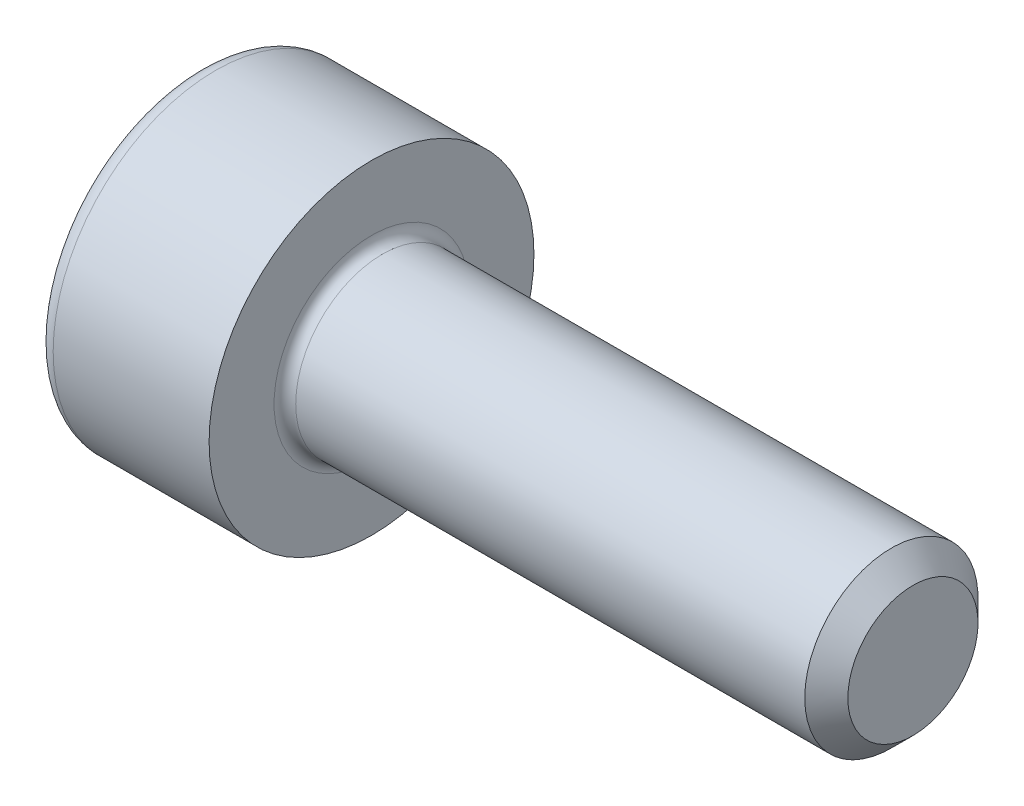
ISO-10303-21;
HEADER;
FILE_DESCRIPTION(('STEP AP214'),'2;1');
FILE_NAME('part.step','',(''),(''),'','','');
FILE_SCHEMA(('AUTOMOTIVE_DESIGN { 1 0 10303 214 1 1 1 1 }'));
ENDSEC;
DATA;
#1=APPLICATION_CONTEXT('core data for automotive mechanical design processes');
#2=APPLICATION_PROTOCOL_DEFINITION('international standard','automotive_design',2000,#1);
#3=PRODUCT_CONTEXT('',#1,'mechanical');
#4=PRODUCT('Part','Part','',(#3));
#5=PRODUCT_RELATED_PRODUCT_CATEGORY('part','',(#4));
#6=PRODUCT_DEFINITION_FORMATION('','',#4);
#7=PRODUCT_DEFINITION_CONTEXT('part definition',#1,'design');
#8=PRODUCT_DEFINITION('design','',#6,#7);
#9=PRODUCT_DEFINITION_SHAPE('','',#8);
#10=(LENGTH_UNIT() NAMED_UNIT(*) SI_UNIT(.MILLI.,.METRE.));
#11=(NAMED_UNIT(*) PLANE_ANGLE_UNIT() SI_UNIT($,.RADIAN.));
#12=(NAMED_UNIT(*) SI_UNIT($,.STERADIAN.) SOLID_ANGLE_UNIT());
#13=UNCERTAINTY_MEASURE_WITH_UNIT(LENGTH_MEASURE(1.E-05),#10,'distance_accuracy_value','');
#14=(GEOMETRIC_REPRESENTATION_CONTEXT(3) GLOBAL_UNCERTAINTY_ASSIGNED_CONTEXT((#13)) GLOBAL_UNIT_ASSIGNED_CONTEXT((#10,
#11,#12)) REPRESENTATION_CONTEXT('',''));
#15=CARTESIAN_POINT('',(0.,0.,0.));
#16=DIRECTION('',(0.,0.,1.));
#17=DIRECTION('',(1.,0.,0.));
#18=AXIS2_PLACEMENT_3D('',#15,#16,#17);
#19=CARTESIAN_POINT('',(0.,0.,0.));
#20=DIRECTION('',(-1.,0.,0.));
#21=DIRECTION('',(0.,0.,1.));
#22=AXIS2_PLACEMENT_3D('',#19,#20,#21);
#23=PLANE('',#22);
#24=DIRECTION('',(0.,-0.499999999999998,0.866025403784439));
#25=VECTOR('',#24,1.);
#26=CARTESIAN_POINT('',(0.,0.877572409168226,0.));
#27=LINE('',#26,#25);
#28=CARTESIAN_POINT('',(0.,0.877572409168226,0.));
#29=VERTEX_POINT('',#28);
#30=CARTESIAN_POINT('',(0.,0.438786204584111,0.759999999999998));
#31=VERTEX_POINT('',#30);
#32=EDGE_CURVE('E260',#29,#31,#27,.T.);
#33=ORIENTED_EDGE('',*,*,#32,.T.);
#34=DIRECTION('',(0.,1.,0.));
#35=VECTOR('',#34,1.);
#36=CARTESIAN_POINT('',(0.,-0.43878620458412,0.759999999999999));
#37=LINE('',#36,#35);
#38=CARTESIAN_POINT('',(0.,-0.43878620458412,0.759999999999999));
#39=VERTEX_POINT('',#38);
#40=EDGE_CURVE('E132',#39,#31,#37,.T.);
#41=ORIENTED_EDGE('',*,*,#40,.F.);
#42=DIRECTION('',(0.,-0.500000000000001,-0.866025403784438));
#43=VECTOR('',#42,1.);
#44=CARTESIAN_POINT('',(0.,-0.43878620458412,0.759999999999999));
#45=LINE('',#44,#43);
#46=CARTESIAN_POINT('',(0.,-0.877572409168236,0.));
#47=VERTEX_POINT('',#46);
#48=EDGE_CURVE('E263',#39,#47,#45,.T.);
#49=ORIENTED_EDGE('',*,*,#48,.T.);
#50=DIRECTION('',(0.,0.499999999999998,-0.86602540378444));
#51=VECTOR('',#50,1.);
#52=CARTESIAN_POINT('',(0.,-0.877572409168236,0.));
#53=LINE('',#52,#51);
#54=CARTESIAN_POINT('',(0.,-0.438786204584122,-0.760000000000001));
#55=VERTEX_POINT('',#54);
#56=EDGE_CURVE('E266',#47,#55,#53,.T.);
#57=ORIENTED_EDGE('',*,*,#56,.T.);
#58=DIRECTION('',(0.,-1.,0.));
#59=VECTOR('',#58,1.);
#60=CARTESIAN_POINT('',(0.,0.438786204584109,-0.760000000000002));
#61=LINE('',#60,#59);
#62=CARTESIAN_POINT('',(0.,0.438786204584109,-0.760000000000002));
#63=VERTEX_POINT('',#62);
#64=EDGE_CURVE('E269',#63,#55,#61,.T.);
#65=ORIENTED_EDGE('',*,*,#64,.F.);
#66=DIRECTION('',(0.,-0.500000000000001,-0.866025403784438));
#67=VECTOR('',#66,1.);
#68=CARTESIAN_POINT('',(0.,0.877572409168226,0.));
#69=LINE('',#68,#67);
#70=EDGE_CURVE('E127',#29,#63,#69,.T.);
#71=ORIENTED_EDGE('',*,*,#70,.F.);
#72=EDGE_LOOP('',(#33,#41,#49,#57,#65,#71));
#73=FACE_BOUND('',#72,.T.);
#74=CARTESIAN_POINT('',(0.,0.,0.));
#75=DIRECTION('',(-1.,0.,0.));
#76=DIRECTION('',(0.,0.,1.));
#77=AXIS2_PLACEMENT_3D('',#74,#75,#76);
#78=CIRCLE('',#77,1.34);
#79=CARTESIAN_POINT('',(0.,0.,1.34));
#80=VERTEX_POINT('',#79);
#81=EDGE_CURVE('E44',#80,#80,#78,.T.);
#82=ORIENTED_EDGE('',*,*,#81,.T.);
#83=EDGE_LOOP('',(#82));
#84=FACE_BOUND('',#83,.T.);
#85=ADVANCED_FACE('F36',(#73,#84),#23,.T.);
#86=CARTESIAN_POINT('',(-31.75,0.,0.));
#87=DIRECTION('',(-1.,0.,0.));
#88=DIRECTION('',(0.,0.,1.));
#89=AXIS2_PLACEMENT_3D('',#86,#87,#88);
#90=CYLINDRICAL_SURFACE('',#89,1.5);
#91=CARTESIAN_POINT('',(0.16,0.,0.));
#92=DIRECTION('',(-1.,0.,0.));
#93=DIRECTION('',(0.,0.,1.));
#94=AXIS2_PLACEMENT_3D('',#91,#92,#93);
#95=CIRCLE('',#94,1.5);
#96=CARTESIAN_POINT('',(0.16,0.,1.5));
#97=VERTEX_POINT('',#96);
#98=EDGE_CURVE('E11',#97,#97,#95,.F.);
#99=ORIENTED_EDGE('',*,*,#98,.T.);
#100=EDGE_LOOP('',(#99));
#101=FACE_BOUND('',#100,.T.);
#102=CARTESIAN_POINT('',(1.6,0.,0.));
#103=DIRECTION('',(-1.,0.,0.));
#104=DIRECTION('',(0.,0.,1.));
#105=AXIS2_PLACEMENT_3D('',#102,#103,#104);
#106=CIRCLE('',#105,1.5);
#107=CARTESIAN_POINT('',(1.6,0.,1.5));
#108=VERTEX_POINT('',#107);
#109=EDGE_CURVE('E150',#108,#108,#106,.T.);
#110=ORIENTED_EDGE('',*,*,#109,.T.);
#111=EDGE_LOOP('',(#110));
#112=FACE_BOUND('',#111,.T.);
#113=ADVANCED_FACE('F174',(#101,#112),#90,.T.);
#114=CARTESIAN_POINT('',(1.6,1.5,0.));
#115=DIRECTION('',(1.,0.,0.));
#116=DIRECTION('',(0.,0.,-1.));
#117=AXIS2_PLACEMENT_3D('',#114,#115,#116);
#118=PLANE('',#117);
#119=CARTESIAN_POINT('',(1.6,0.,0.));
#120=DIRECTION('',(1.,0.,0.));
#121=DIRECTION('',(0.,0.,-1.));
#122=AXIS2_PLACEMENT_3D('',#119,#120,#121);
#123=CIRCLE('',#122,0.9);
#124=CARTESIAN_POINT('',(1.6,0.,-0.9));
#125=VERTEX_POINT('',#124);
#126=EDGE_CURVE('E153',#125,#125,#123,.F.);
#127=ORIENTED_EDGE('',*,*,#126,.T.);
#128=EDGE_LOOP('',(#127));
#129=FACE_BOUND('',#128,.T.);
#130=ORIENTED_EDGE('',*,*,#109,.F.);
#131=EDGE_LOOP('',(#130));
#132=FACE_BOUND('',#131,.T.);
#133=ADVANCED_FACE('F180',(#129,#132),#118,.T.);
#134=CARTESIAN_POINT('',(-31.75,0.,0.));
#135=DIRECTION('',(-1.,0.,0.));
#136=DIRECTION('',(0.,0.,1.));
#137=AXIS2_PLACEMENT_3D('',#134,#135,#136);
#138=CYLINDRICAL_SURFACE('',#137,0.8);
#139=CARTESIAN_POINT('',(1.7,0.,0.));
#140=DIRECTION('',(1.,0.,0.));
#141=DIRECTION('',(0.,0.,-1.));
#142=AXIS2_PLACEMENT_3D('',#139,#140,#141);
#143=CIRCLE('',#142,0.8);
#144=CARTESIAN_POINT('',(1.7,0.,-0.8));
#145=VERTEX_POINT('',#144);
#146=EDGE_CURVE('E156',#145,#145,#143,.T.);
#147=ORIENTED_EDGE('',*,*,#146,.T.);
#148=EDGE_LOOP('',(#147));
#149=FACE_BOUND('',#148,.T.);
#150=CARTESIAN_POINT('',(6.401,0.,0.));
#151=DIRECTION('',(-1.,0.,0.));
#152=DIRECTION('',(0.,0.,1.));
#153=AXIS2_PLACEMENT_3D('',#150,#151,#152);
#154=CIRCLE('',#153,0.8);
#155=CARTESIAN_POINT('',(6.401,0.,0.8));
#156=VERTEX_POINT('',#155);
#157=EDGE_CURVE('E147',#156,#156,#154,.T.);
#158=ORIENTED_EDGE('',*,*,#157,.T.);
#159=EDGE_LOOP('',(#158));
#160=FACE_BOUND('',#159,.T.);
#161=ADVANCED_FACE('F186',(#149,#160),#138,.T.);
#162=CARTESIAN_POINT('',(6.6,0.,0.));
#163=DIRECTION('',(-1.,0.,0.));
#164=DIRECTION('',(0.,0.,1.));
#165=AXIS2_PLACEMENT_3D('',#162,#163,#164);
#166=CONICAL_SURFACE('',#165,0.601,0.785398163397454);
#167=ORIENTED_EDGE('',*,*,#157,.F.);
#168=EDGE_LOOP('',(#167));
#169=FACE_BOUND('',#168,.T.);
#170=CARTESIAN_POINT('',(6.6,0.,0.));
#171=DIRECTION('',(-1.,0.,0.));
#172=DIRECTION('',(0.,0.,1.));
#173=AXIS2_PLACEMENT_3D('',#170,#171,#172);
#174=CIRCLE('',#173,0.601);
#175=CARTESIAN_POINT('',(6.6,0.,0.601));
#176=VERTEX_POINT('',#175);
#177=EDGE_CURVE('E143',#176,#176,#174,.T.);
#178=ORIENTED_EDGE('',*,*,#177,.T.);
#179=EDGE_LOOP('',(#178));
#180=FACE_BOUND('',#179,.T.);
#181=ADVANCED_FACE('F190',(#169,#180),#166,.T.);
#182=CARTESIAN_POINT('',(6.6,0.601,0.));
#183=DIRECTION('',(1.,0.,0.));
#184=DIRECTION('',(0.,0.,-1.));
#185=AXIS2_PLACEMENT_3D('',#182,#183,#184);
#186=PLANE('',#185);
#187=ORIENTED_EDGE('',*,*,#177,.F.);
#188=EDGE_LOOP('',(#187));
#189=FACE_BOUND('',#188,.T.);
#190=ADVANCED_FACE('F170',(#189),#186,.T.);
#191=CARTESIAN_POINT('',(1.7,0.,0.));
#192=DIRECTION('',(1.,0.,0.));
#193=DIRECTION('',(0.,0.,-1.));
#194=AXIS2_PLACEMENT_3D('',#191,#192,#193);
#195=TOROIDAL_SURFACE('',#194,0.9,0.1);
#196=ORIENTED_EDGE('',*,*,#146,.F.);
#197=EDGE_LOOP('',(#196));
#198=FACE_BOUND('',#197,.T.);
#199=ORIENTED_EDGE('',*,*,#126,.F.);
#200=EDGE_LOOP('',(#199));
#201=FACE_BOUND('',#200,.T.);
#202=ADVANCED_FACE('F163',(#198,#201),#195,.F.);
#203=CARTESIAN_POINT('',(0.16,0.,0.));
#204=DIRECTION('',(-1.,0.,0.));
#205=DIRECTION('',(0.,0.,1.));
#206=AXIS2_PLACEMENT_3D('',#203,#204,#205);
#207=TOROIDAL_SURFACE('',#206,1.34,0.16);
#208=ORIENTED_EDGE('',*,*,#98,.F.);
#209=EDGE_LOOP('',(#208));
#210=FACE_BOUND('',#209,.T.);
#211=ORIENTED_EDGE('',*,*,#81,.F.);
#212=EDGE_LOOP('',(#211));
#213=FACE_BOUND('',#212,.T.);
#214=ADVANCED_FACE('F38',(#210,#213),#207,.T.);
#215=CARTESIAN_POINT('',(0.7,0.877572409168226,0.));
#216=DIRECTION('',(0.,-0.86602540378444,-0.499999999999998));
#217=DIRECTION('',(0.,0.499999999999998,-0.86602540378444));
#218=AXIS2_PLACEMENT_3D('',#215,#216,#217);
#219=PLANE('',#218);
#220=ORIENTED_EDGE('',*,*,#32,.F.);
#221=DIRECTION('',(-1.,0.,0.));
#222=VECTOR('',#221,1.);
#223=CARTESIAN_POINT('',(0.7,0.877572409168226,0.));
#224=LINE('',#223,#222);
#225=CARTESIAN_POINT('',(0.7,0.877572409168226,0.));
#226=VERTEX_POINT('',#225);
#227=EDGE_CURVE('E250',#226,#29,#224,.T.);
#228=ORIENTED_EDGE('',*,*,#227,.F.);
#229=DIRECTION('',(0.,-0.499999999999998,0.866025403784439));
#230=VECTOR('',#229,1.);
#231=CARTESIAN_POINT('',(0.7,0.877572409168226,0.));
#232=LINE('',#231,#230);
#233=CARTESIAN_POINT('',(0.7,0.658179306876169,0.379999999999996));
#234=VERTEX_POINT('',#233);
#235=EDGE_CURVE('E119',#226,#234,#232,.T.);
#236=ORIENTED_EDGE('',*,*,#235,.T.);
#237=CARTESIAN_POINT('',(0.7,0.438786204584111,0.759999999999998));
#238=VERTEX_POINT('',#237);
#239=EDGE_CURVE('E110',#234,#238,#232,.T.);
#240=ORIENTED_EDGE('',*,*,#239,.T.);
#241=DIRECTION('',(-1.,0.,0.));
#242=VECTOR('',#241,1.);
#243=CARTESIAN_POINT('',(0.7,0.438786204584111,0.759999999999998));
#244=LINE('',#243,#242);
#245=EDGE_CURVE('E124',#238,#31,#244,.T.);
#246=ORIENTED_EDGE('',*,*,#245,.T.);
#247=EDGE_LOOP('',(#220,#228,#236,#240,#246));
#248=FACE_BOUND('',#247,.T.);
#249=ADVANCED_FACE('F123',(#248),#219,.T.);
#250=CARTESIAN_POINT('',(0.7,-0.43878620458412,0.759999999999999));
#251=DIRECTION('',(0.,0.,1.));
#252=DIRECTION('',(0.,-1.,0.));
#253=AXIS2_PLACEMENT_3D('',#250,#251,#252);
#254=PLANE('',#253);
#255=ORIENTED_EDGE('',*,*,#40,.T.);
#256=ORIENTED_EDGE('',*,*,#245,.F.);
#257=DIRECTION('',(0.,1.,0.));
#258=VECTOR('',#257,1.);
#259=CARTESIAN_POINT('',(0.7,-0.43878620458412,0.759999999999999));
#260=LINE('',#259,#258);
#261=CARTESIAN_POINT('',(0.7,0.,0.759999999999999));
#262=VERTEX_POINT('',#261);
#263=EDGE_CURVE('E107',#262,#238,#260,.T.);
#264=ORIENTED_EDGE('',*,*,#263,.F.);
#265=CARTESIAN_POINT('',(0.7,-0.43878620458412,0.759999999999999));
#266=VERTEX_POINT('',#265);
#267=EDGE_CURVE('E118',#266,#262,#260,.T.);
#268=ORIENTED_EDGE('',*,*,#267,.F.);
#269=DIRECTION('',(-1.,0.,0.));
#270=VECTOR('',#269,1.);
#271=CARTESIAN_POINT('',(0.7,-0.43878620458412,0.759999999999999));
#272=LINE('',#271,#270);
#273=EDGE_CURVE('E134',#266,#39,#272,.T.);
#274=ORIENTED_EDGE('',*,*,#273,.T.);
#275=EDGE_LOOP('',(#255,#256,#264,#268,#274));
#276=FACE_BOUND('',#275,.T.);
#277=ADVANCED_FACE('F129',(#276),#254,.F.);
#278=CARTESIAN_POINT('',(0.7,-0.43878620458412,0.759999999999999));
#279=DIRECTION('',(0.,0.866025403784438,-0.500000000000001));
#280=DIRECTION('',(0.,0.500000000000001,0.866025403784438));
#281=AXIS2_PLACEMENT_3D('',#278,#279,#280);
#282=PLANE('',#281);
#283=ORIENTED_EDGE('',*,*,#48,.F.);
#284=ORIENTED_EDGE('',*,*,#273,.F.);
#285=DIRECTION('',(0.,-0.500000000000001,-0.866025403784438));
#286=VECTOR('',#285,1.);
#287=CARTESIAN_POINT('',(0.7,-0.43878620458412,0.759999999999999));
#288=LINE('',#287,#286);
#289=CARTESIAN_POINT('',(0.7,-0.658179306876176,0.380000000000003));
#290=VERTEX_POINT('',#289);
#291=EDGE_CURVE('E289',#266,#290,#288,.T.);
#292=ORIENTED_EDGE('',*,*,#291,.T.);
#293=CARTESIAN_POINT('',(0.7,-0.877572409168236,0.));
#294=VERTEX_POINT('',#293);
#295=EDGE_CURVE('E278',#290,#294,#288,.T.);
#296=ORIENTED_EDGE('',*,*,#295,.T.);
#297=DIRECTION('',(-1.,0.,0.));
#298=VECTOR('',#297,1.);
#299=CARTESIAN_POINT('',(0.7,-0.877572409168236,0.));
#300=LINE('',#299,#298);
#301=EDGE_CURVE('E139',#294,#47,#300,.T.);
#302=ORIENTED_EDGE('',*,*,#301,.T.);
#303=EDGE_LOOP('',(#283,#284,#292,#296,#302));
#304=FACE_BOUND('',#303,.T.);
#305=ADVANCED_FACE('F204',(#304),#282,.T.);
#306=CARTESIAN_POINT('',(0.7,-0.877572409168236,0.));
#307=DIRECTION('',(0.,0.86602540378444,0.499999999999998));
#308=DIRECTION('',(0.,-0.499999999999998,0.86602540378444));
#309=AXIS2_PLACEMENT_3D('',#306,#307,#308);
#310=PLANE('',#309);
#311=ORIENTED_EDGE('',*,*,#56,.F.);
#312=ORIENTED_EDGE('',*,*,#301,.F.);
#313=DIRECTION('',(0.,0.499999999999998,-0.86602540378444));
#314=VECTOR('',#313,1.);
#315=CARTESIAN_POINT('',(0.7,-0.877572409168236,0.));
#316=LINE('',#315,#314);
#317=CARTESIAN_POINT('',(0.7,-0.658179306876179,-0.380000000000001));
#318=VERTEX_POINT('',#317);
#319=EDGE_CURVE('E256',#294,#318,#316,.T.);
#320=ORIENTED_EDGE('',*,*,#319,.T.);
#321=CARTESIAN_POINT('',(0.7,-0.438786204584122,-0.760000000000001));
#322=VERTEX_POINT('',#321);
#323=EDGE_CURVE('E288',#318,#322,#316,.T.);
#324=ORIENTED_EDGE('',*,*,#323,.T.);
#325=DIRECTION('',(-1.,0.,0.));
#326=VECTOR('',#325,1.);
#327=CARTESIAN_POINT('',(0.7,-0.438786204584122,-0.760000000000001));
#328=LINE('',#327,#326);
#329=EDGE_CURVE('E249',#322,#55,#328,.T.);
#330=ORIENTED_EDGE('',*,*,#329,.T.);
#331=EDGE_LOOP('',(#311,#312,#320,#324,#330));
#332=FACE_BOUND('',#331,.T.);
#333=ADVANCED_FACE('F207',(#332),#310,.T.);
#334=CARTESIAN_POINT('',(0.7,0.438786204584109,-0.760000000000002));
#335=DIRECTION('',(0.,0.,-1.));
#336=DIRECTION('',(0.,1.,0.));
#337=AXIS2_PLACEMENT_3D('',#334,#335,#336);
#338=PLANE('',#337);
#339=ORIENTED_EDGE('',*,*,#64,.T.);
#340=ORIENTED_EDGE('',*,*,#329,.F.);
#341=DIRECTION('',(0.,-1.,0.));
#342=VECTOR('',#341,1.);
#343=CARTESIAN_POINT('',(0.7,0.438786204584109,-0.760000000000002));
#344=LINE('',#343,#342);
#345=CARTESIAN_POINT('',(0.7,0.,-0.76));
#346=VERTEX_POINT('',#345);
#347=EDGE_CURVE('E253',#346,#322,#344,.T.);
#348=ORIENTED_EDGE('',*,*,#347,.F.);
#349=CARTESIAN_POINT('',(0.7,0.438786204584109,-0.760000000000002));
#350=VERTEX_POINT('',#349);
#351=EDGE_CURVE('E51',#350,#346,#344,.T.);
#352=ORIENTED_EDGE('',*,*,#351,.F.);
#353=DIRECTION('',(-1.,0.,0.));
#354=VECTOR('',#353,1.);
#355=CARTESIAN_POINT('',(0.7,0.438786204584109,-0.760000000000002));
#356=LINE('',#355,#354);
#357=EDGE_CURVE('E246',#350,#63,#356,.T.);
#358=ORIENTED_EDGE('',*,*,#357,.T.);
#359=EDGE_LOOP('',(#339,#340,#348,#352,#358));
#360=FACE_BOUND('',#359,.T.);
#361=ADVANCED_FACE('F211',(#360),#338,.F.);
#362=CARTESIAN_POINT('',(0.7,0.877572409168226,0.));
#363=DIRECTION('',(0.,0.866025403784438,-0.500000000000001));
#364=DIRECTION('',(0.,0.500000000000001,0.866025403784438));
#365=AXIS2_PLACEMENT_3D('',#362,#363,#364);
#366=PLANE('',#365);
#367=ORIENTED_EDGE('',*,*,#70,.T.);
#368=ORIENTED_EDGE('',*,*,#357,.F.);
#369=DIRECTION('',(0.,-0.500000000000001,-0.866025403784438));
#370=VECTOR('',#369,1.);
#371=CARTESIAN_POINT('',(0.7,0.877572409168226,0.));
#372=LINE('',#371,#370);
#373=CARTESIAN_POINT('',(0.7,0.658179306876169,-0.379999999999999));
#374=VERTEX_POINT('',#373);
#375=EDGE_CURVE('E236',#374,#350,#372,.T.);
#376=ORIENTED_EDGE('',*,*,#375,.F.);
#377=EDGE_CURVE('E242',#226,#374,#372,.T.);
#378=ORIENTED_EDGE('',*,*,#377,.F.);
#379=ORIENTED_EDGE('',*,*,#227,.T.);
#380=EDGE_LOOP('',(#367,#368,#376,#378,#379));
#381=FACE_BOUND('',#380,.T.);
#382=ADVANCED_FACE('F215',(#381),#366,.F.);
#383=CARTESIAN_POINT('',(0.7,1.31635861375234,-0.760000000000003));
#384=DIRECTION('',(1.,0.,0.));
#385=DIRECTION('',(0.,0.,-1.));
#386=AXIS2_PLACEMENT_3D('',#383,#384,#385);
#387=PLANE('',#386);
#388=ORIENTED_EDGE('',*,*,#347,.T.);
#389=ORIENTED_EDGE('',*,*,#323,.F.);
#390=CARTESIAN_POINT('',(0.7,0.,0.));
#391=DIRECTION('',(-1.,0.,0.));
#392=DIRECTION('',(0.,0.,1.));
#393=AXIS2_PLACEMENT_3D('',#390,#391,#392);
#394=CIRCLE('',#393,0.76);
#395=EDGE_CURVE('E284',#346,#318,#394,.T.);
#396=ORIENTED_EDGE('',*,*,#395,.F.);
#397=EDGE_LOOP('',(#388,#389,#396));
#398=FACE_BOUND('',#397,.T.);
#399=ADVANCED_FACE('F219',(#398),#387,.F.);
#400=ORIENTED_EDGE('',*,*,#319,.F.);
#401=ORIENTED_EDGE('',*,*,#295,.F.);
#402=EDGE_CURVE('E137',#318,#290,#394,.T.);
#403=ORIENTED_EDGE('',*,*,#402,.F.);
#404=EDGE_LOOP('',(#400,#401,#403));
#405=FACE_BOUND('',#404,.T.);
#406=ADVANCED_FACE('F222',(#405),#387,.F.);
#407=ORIENTED_EDGE('',*,*,#291,.F.);
#408=ORIENTED_EDGE('',*,*,#267,.T.);
#409=EDGE_CURVE('E133',#290,#262,#394,.T.);
#410=ORIENTED_EDGE('',*,*,#409,.F.);
#411=EDGE_LOOP('',(#407,#408,#410));
#412=FACE_BOUND('',#411,.T.);
#413=ADVANCED_FACE('F227',(#412),#387,.F.);
#414=ORIENTED_EDGE('',*,*,#263,.T.);
#415=ORIENTED_EDGE('',*,*,#239,.F.);
#416=EDGE_CURVE('E113',#262,#234,#394,.T.);
#417=ORIENTED_EDGE('',*,*,#416,.F.);
#418=EDGE_LOOP('',(#414,#415,#417));
#419=FACE_BOUND('',#418,.T.);
#420=ADVANCED_FACE('F109',(#419),#387,.F.);
#421=ORIENTED_EDGE('',*,*,#235,.F.);
#422=ORIENTED_EDGE('',*,*,#377,.T.);
#423=EDGE_CURVE('E144',#234,#374,#394,.T.);
#424=ORIENTED_EDGE('',*,*,#423,.F.);
#425=EDGE_LOOP('',(#421,#422,#424));
#426=FACE_BOUND('',#425,.T.);
#427=ADVANCED_FACE('F230',(#426),#387,.F.);
#428=ORIENTED_EDGE('',*,*,#375,.T.);
#429=ORIENTED_EDGE('',*,*,#351,.T.);
#430=EDGE_CURVE('E239',#374,#346,#394,.T.);
#431=ORIENTED_EDGE('',*,*,#430,.F.);
#432=EDGE_LOOP('',(#428,#429,#431));
#433=FACE_BOUND('',#432,.T.);
#434=ADVANCED_FACE('F200',(#433),#387,.F.);
#435=CARTESIAN_POINT('',(0.7,0.,0.));
#436=DIRECTION('',(-1.,0.,0.));
#437=DIRECTION('',(0.,0.,1.));
#438=AXIS2_PLACEMENT_3D('',#435,#436,#437);
#439=CONICAL_SURFACE('',#438,0.76,1.0471975511966);
#440=CARTESIAN_POINT('',(1.13878620458412,0.,0.));
#441=VERTEX_POINT('',#440);
#442=VERTEX_LOOP('',#441);
#443=FACE_BOUND('',#442,.T.);
#444=ORIENTED_EDGE('',*,*,#416,.T.);
#445=ORIENTED_EDGE('',*,*,#423,.T.);
#446=ORIENTED_EDGE('',*,*,#430,.T.);
#447=ORIENTED_EDGE('',*,*,#395,.T.);
#448=ORIENTED_EDGE('',*,*,#402,.T.);
#449=ORIENTED_EDGE('',*,*,#409,.T.);
#450=EDGE_LOOP('',(#444,#445,#446,#447,#448,#449));
#451=FACE_BOUND('',#450,.T.);
#452=ADVANCED_FACE('F198',(#443,#451),#439,.F.);
#453=CLOSED_SHELL('',(#85,#113,#133,#161,#181,#190,#202,#214,#249,#277,#305,#333,#361,#382,#399,
#406,#413,#420,#427,#434,#452));
#454=MANIFOLD_SOLID_BREP('B2',#453);
#455=ADVANCED_BREP_SHAPE_REPRESENTATION('',(#18,#454),#14);
#456=SHAPE_DEFINITION_REPRESENTATION(#9,#455);
ENDSEC;
END-ISO-10303-21;
